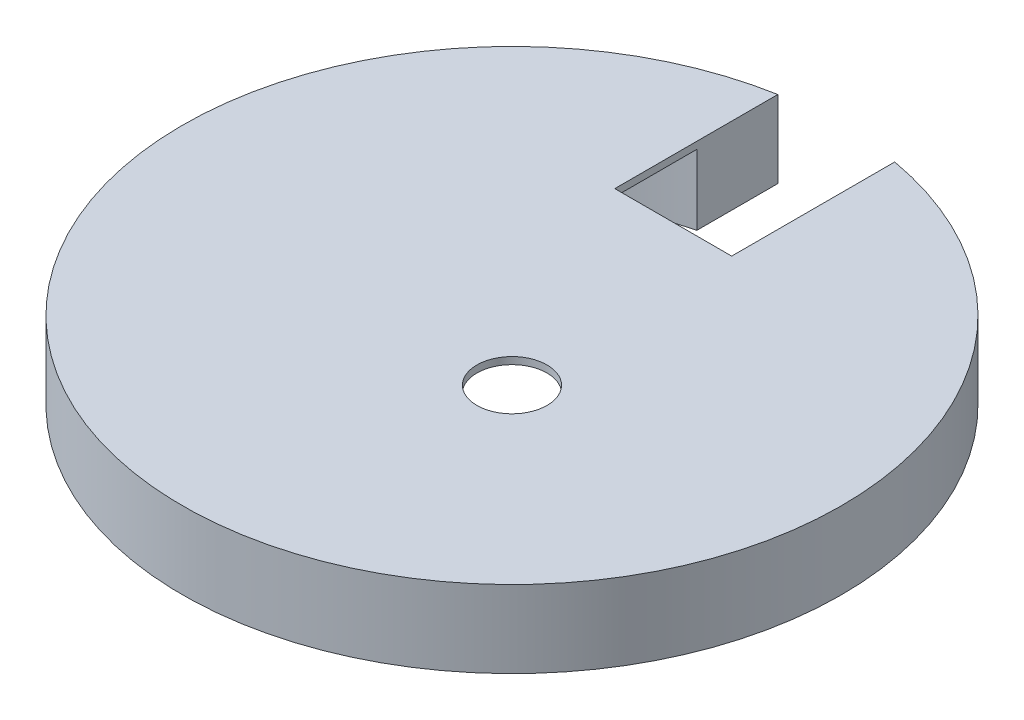
ISO-10303-21;
HEADER;
FILE_DESCRIPTION(('STEP AP214'),'2;1');
FILE_NAME('part.step','',(''),(''),'','','');
FILE_SCHEMA(('AUTOMOTIVE_DESIGN { 1 0 10303 214 1 1 1 1 }'));
ENDSEC;
DATA;
#1=APPLICATION_CONTEXT('core data for automotive mechanical design processes');
#2=APPLICATION_PROTOCOL_DEFINITION('international standard','automotive_design',2000,#1);
#3=PRODUCT_CONTEXT('',#1,'mechanical');
#4=PRODUCT('Part','Part','',(#3));
#5=PRODUCT_RELATED_PRODUCT_CATEGORY('part','',(#4));
#6=PRODUCT_DEFINITION_FORMATION('','',#4);
#7=PRODUCT_DEFINITION_CONTEXT('part definition',#1,'design');
#8=PRODUCT_DEFINITION('design','',#6,#7);
#9=PRODUCT_DEFINITION_SHAPE('','',#8);
#10=(LENGTH_UNIT() NAMED_UNIT(*) SI_UNIT(.MILLI.,.METRE.));
#11=(NAMED_UNIT(*) PLANE_ANGLE_UNIT() SI_UNIT($,.RADIAN.));
#12=(NAMED_UNIT(*) SI_UNIT($,.STERADIAN.) SOLID_ANGLE_UNIT());
#13=UNCERTAINTY_MEASURE_WITH_UNIT(LENGTH_MEASURE(1.E-05),#10,'distance_accuracy_value','');
#14=(GEOMETRIC_REPRESENTATION_CONTEXT(3) GLOBAL_UNCERTAINTY_ASSIGNED_CONTEXT((#13)) GLOBAL_UNIT_ASSIGNED_CONTEXT((#10,
#11,#12)) REPRESENTATION_CONTEXT('',''));
#15=CARTESIAN_POINT('',(0.,0.,0.));
#16=DIRECTION('',(0.,0.,1.));
#17=DIRECTION('',(1.,0.,0.));
#18=AXIS2_PLACEMENT_3D('',#15,#16,#17);
#19=CARTESIAN_POINT('',(0.,10.,0.));
#20=DIRECTION('',(0.,-1.,0.));
#21=DIRECTION('',(0.,0.,-1.));
#22=AXIS2_PLACEMENT_3D('',#19,#20,#21);
#23=CYLINDRICAL_SURFACE('',#22,46.97);
#24=CARTESIAN_POINT('',(0.,0.,0.));
#25=DIRECTION('',(0.,1.,0.));
#26=DIRECTION('',(0.,0.,1.));
#27=AXIS2_PLACEMENT_3D('',#24,#25,#26);
#28=CIRCLE('',#27,46.97);
#29=CARTESIAN_POINT('',(-8.33,0.,-46.2254475370439));
#30=VERTEX_POINT('',#29);
#31=CARTESIAN_POINT('',(8.33,0.,-46.2254475370439));
#32=VERTEX_POINT('',#31);
#33=EDGE_CURVE('E86',#30,#32,#28,.T.);
#34=ORIENTED_EDGE('',*,*,#33,.T.);
#35=DIRECTION('',(0.,-1.,0.));
#36=VECTOR('',#35,1.);
#37=CARTESIAN_POINT('',(8.33,10.,-46.2254475370439));
#38=LINE('',#37,#36);
#39=CARTESIAN_POINT('',(8.33,11.,-46.2254475370439));
#40=VERTEX_POINT('',#39);
#41=EDGE_CURVE('E11',#40,#32,#38,.T.);
#42=ORIENTED_EDGE('',*,*,#41,.F.);
#43=CARTESIAN_POINT('',(0.,11.,0.));
#44=DIRECTION('',(0.,1.,0.));
#45=DIRECTION('',(0.,0.,1.));
#46=AXIS2_PLACEMENT_3D('',#43,#44,#45);
#47=CIRCLE('',#46,46.97);
#48=CARTESIAN_POINT('',(-8.33,11.,-46.2254475370439));
#49=VERTEX_POINT('',#48);
#50=EDGE_CURVE('E97',#49,#40,#47,.T.);
#51=ORIENTED_EDGE('',*,*,#50,.F.);
#52=DIRECTION('',(0.,-1.,0.));
#53=VECTOR('',#52,1.);
#54=CARTESIAN_POINT('',(-8.33,10.,-46.2254475370439));
#55=LINE('',#54,#53);
#56=EDGE_CURVE('E81',#49,#30,#55,.T.);
#57=ORIENTED_EDGE('',*,*,#56,.T.);
#58=EDGE_LOOP('',(#34,#42,#51,#57));
#59=FACE_BOUND('',#58,.T.);
#60=ADVANCED_FACE('F33',(#59),#23,.T.);
#61=CARTESIAN_POINT('',(8.33,10.,-34.6855135187948));
#62=DIRECTION('',(1.,0.,0.));
#63=DIRECTION('',(0.,0.,-1.));
#64=AXIS2_PLACEMENT_3D('',#61,#62,#63);
#65=PLANE('',#64);
#66=DIRECTION('',(0.,0.,1.));
#67=VECTOR('',#66,1.);
#68=CARTESIAN_POINT('',(8.33,0.,-34.6855135187948));
#69=LINE('',#68,#67);
#70=CARTESIAN_POINT('',(8.33,0.,-34.6855135187948));
#71=VERTEX_POINT('',#70);
#72=EDGE_CURVE('E71',#32,#71,#69,.T.);
#73=ORIENTED_EDGE('',*,*,#72,.T.);
#74=DIRECTION('',(0.,-1.,0.));
#75=VECTOR('',#74,1.);
#76=CARTESIAN_POINT('',(8.33,10.,-34.6855135187948));
#77=LINE('',#76,#75);
#78=CARTESIAN_POINT('',(8.33,10.,-34.6855135187948));
#79=VERTEX_POINT('',#78);
#80=EDGE_CURVE('E41',#79,#71,#77,.T.);
#81=ORIENTED_EDGE('',*,*,#80,.F.);
#82=DIRECTION('',(0.,0.,1.));
#83=VECTOR('',#82,1.);
#84=CARTESIAN_POINT('',(8.33,10.,-22.9854475370439));
#85=LINE('',#84,#83);
#86=CARTESIAN_POINT('',(8.33,10.,-22.9854475370439));
#87=VERTEX_POINT('',#86);
#88=EDGE_CURVE('E119',#79,#87,#85,.T.);
#89=ORIENTED_EDGE('',*,*,#88,.T.);
#90=DIRECTION('',(0.,-1.,0.));
#91=VECTOR('',#90,1.);
#92=CARTESIAN_POINT('',(8.33,11.,-22.9854475370439));
#93=LINE('',#92,#91);
#94=CARTESIAN_POINT('',(8.33,11.,-22.9854475370439));
#95=VERTEX_POINT('',#94);
#96=EDGE_CURVE('E113',#95,#87,#93,.T.);
#97=ORIENTED_EDGE('',*,*,#96,.F.);
#98=DIRECTION('',(0.,0.,1.));
#99=VECTOR('',#98,1.);
#100=CARTESIAN_POINT('',(8.33,11.,-22.9854475370439));
#101=LINE('',#100,#99);
#102=EDGE_CURVE('E115',#40,#95,#101,.T.);
#103=ORIENTED_EDGE('',*,*,#102,.F.);
#104=ORIENTED_EDGE('',*,*,#41,.T.);
#105=EDGE_LOOP('',(#73,#81,#89,#97,#103,#104));
#106=FACE_BOUND('',#105,.T.);
#107=ADVANCED_FACE('F128',(#106),#65,.F.);
#108=CARTESIAN_POINT('',(0.,10.,0.));
#109=DIRECTION('',(0.,-1.,0.));
#110=DIRECTION('',(0.,0.,-1.));
#111=AXIS2_PLACEMENT_3D('',#108,#109,#110);
#112=CYLINDRICAL_SURFACE('',#111,35.67175);
#113=CARTESIAN_POINT('',(0.,0.,0.));
#114=DIRECTION('',(0.,-1.,0.));
#115=DIRECTION('',(0.,0.,1.));
#116=AXIS2_PLACEMENT_3D('',#113,#114,#115);
#117=CIRCLE('',#116,35.67175);
#118=CARTESIAN_POINT('',(-8.33,0.,-34.6855135187948));
#119=VERTEX_POINT('',#118);
#120=EDGE_CURVE('E63',#71,#119,#117,.T.);
#121=ORIENTED_EDGE('',*,*,#120,.T.);
#122=DIRECTION('',(0.,-1.,0.));
#123=VECTOR('',#122,1.);
#124=CARTESIAN_POINT('',(-8.33,10.,-34.6855135187948));
#125=LINE('',#124,#123);
#126=CARTESIAN_POINT('',(-8.33,10.,-34.6855135187948));
#127=VERTEX_POINT('',#126);
#128=EDGE_CURVE('E66',#127,#119,#125,.T.);
#129=ORIENTED_EDGE('',*,*,#128,.F.);
#130=CARTESIAN_POINT('',(0.,10.,0.));
#131=DIRECTION('',(0.,-1.,0.));
#132=DIRECTION('',(0.,0.,1.));
#133=AXIS2_PLACEMENT_3D('',#130,#131,#132);
#134=CIRCLE('',#133,35.67175);
#135=EDGE_CURVE('E87',#79,#127,#134,.T.);
#136=ORIENTED_EDGE('',*,*,#135,.F.);
#137=ORIENTED_EDGE('',*,*,#80,.T.);
#138=EDGE_LOOP('',(#121,#129,#136,#137));
#139=FACE_BOUND('',#138,.T.);
#140=ADVANCED_FACE('F65',(#139),#112,.F.);
#141=CARTESIAN_POINT('',(-8.33,10.,-46.2254475370439));
#142=DIRECTION('',(-1.,0.,0.));
#143=DIRECTION('',(0.,0.,1.));
#144=AXIS2_PLACEMENT_3D('',#141,#142,#143);
#145=PLANE('',#144);
#146=DIRECTION('',(0.,0.,-1.));
#147=VECTOR('',#146,1.);
#148=CARTESIAN_POINT('',(-8.33,0.,-46.2254475370439));
#149=LINE('',#148,#147);
#150=EDGE_CURVE('E70',#119,#30,#149,.T.);
#151=ORIENTED_EDGE('',*,*,#150,.T.);
#152=ORIENTED_EDGE('',*,*,#56,.F.);
#153=DIRECTION('',(0.,0.,-1.));
#154=VECTOR('',#153,1.);
#155=CARTESIAN_POINT('',(-8.33,11.,-46.2254475370439));
#156=LINE('',#155,#154);
#157=CARTESIAN_POINT('',(-8.33,11.,-22.9854475370439));
#158=VERTEX_POINT('',#157);
#159=EDGE_CURVE('E101',#158,#49,#156,.T.);
#160=ORIENTED_EDGE('',*,*,#159,.F.);
#161=DIRECTION('',(0.,-1.,0.));
#162=VECTOR('',#161,1.);
#163=CARTESIAN_POINT('',(-8.33,11.,-22.9854475370439));
#164=LINE('',#163,#162);
#165=CARTESIAN_POINT('',(-8.33,10.,-22.9854475370439));
#166=VERTEX_POINT('',#165);
#167=EDGE_CURVE('E111',#158,#166,#164,.T.);
#168=ORIENTED_EDGE('',*,*,#167,.T.);
#169=DIRECTION('',(0.,0.,-1.));
#170=VECTOR('',#169,1.);
#171=CARTESIAN_POINT('',(-8.33,10.,-46.2254475370439));
#172=LINE('',#171,#170);
#173=EDGE_CURVE('E80',#166,#127,#172,.T.);
#174=ORIENTED_EDGE('',*,*,#173,.T.);
#175=ORIENTED_EDGE('',*,*,#128,.T.);
#176=EDGE_LOOP('',(#151,#152,#160,#168,#174,#175));
#177=FACE_BOUND('',#176,.T.);
#178=ADVANCED_FACE('F75',(#177),#145,.F.);
#179=CARTESIAN_POINT('',(0.,0.,0.));
#180=DIRECTION('',(0.,1.,0.));
#181=DIRECTION('',(0.,0.,1.));
#182=AXIS2_PLACEMENT_3D('',#179,#180,#181);
#183=PLANE('',#182);
#184=ORIENTED_EDGE('',*,*,#33,.F.);
#185=ORIENTED_EDGE('',*,*,#150,.F.);
#186=ORIENTED_EDGE('',*,*,#120,.F.);
#187=ORIENTED_EDGE('',*,*,#72,.F.);
#188=EDGE_LOOP('',(#184,#185,#186,#187));
#189=FACE_BOUND('',#188,.T.);
#190=ADVANCED_FACE('F84',(#189),#183,.F.);
#191=CARTESIAN_POINT('',(0.,10.,0.));
#192=DIRECTION('',(0.,1.,0.));
#193=DIRECTION('',(0.,0.,1.));
#194=AXIS2_PLACEMENT_3D('',#191,#192,#193);
#195=PLANE('',#194);
#196=CARTESIAN_POINT('',(8.6054895270403,10.,8.60548952704027));
#197=DIRECTION('',(0.,1.,0.));
#198=DIRECTION('',(0.,0.,1.));
#199=AXIS2_PLACEMENT_3D('',#196,#197,#198);
#200=CIRCLE('',#199,5.);
#201=CARTESIAN_POINT('',(8.6054895270403,10.,13.6054895270403));
#202=VERTEX_POINT('',#201);
#203=EDGE_CURVE('E122',#202,#202,#200,.T.);
#204=ORIENTED_EDGE('',*,*,#203,.T.);
#205=EDGE_LOOP('',(#204));
#206=FACE_BOUND('',#205,.T.);
#207=ORIENTED_EDGE('',*,*,#88,.F.);
#208=ORIENTED_EDGE('',*,*,#135,.T.);
#209=ORIENTED_EDGE('',*,*,#173,.F.);
#210=DIRECTION('',(-1.,0.,0.));
#211=VECTOR('',#210,1.);
#212=CARTESIAN_POINT('',(-8.33,10.,-22.9854475370439));
#213=LINE('',#212,#211);
#214=EDGE_CURVE('E121',#87,#166,#213,.T.);
#215=ORIENTED_EDGE('',*,*,#214,.F.);
#216=EDGE_LOOP('',(#207,#208,#209,#215));
#217=FACE_BOUND('',#216,.T.);
#218=ADVANCED_FACE('F143',(#206,#217),#195,.F.);
#219=CARTESIAN_POINT('',(-8.33,11.,-22.9854475370439));
#220=DIRECTION('',(0.,0.,1.));
#221=DIRECTION('',(1.,0.,0.));
#222=AXIS2_PLACEMENT_3D('',#219,#220,#221);
#223=PLANE('',#222);
#224=ORIENTED_EDGE('',*,*,#214,.T.);
#225=ORIENTED_EDGE('',*,*,#167,.F.);
#226=DIRECTION('',(-1.,0.,0.));
#227=VECTOR('',#226,1.);
#228=CARTESIAN_POINT('',(-8.33,11.,-22.9854475370439));
#229=LINE('',#228,#227);
#230=EDGE_CURVE('E109',#95,#158,#229,.T.);
#231=ORIENTED_EDGE('',*,*,#230,.F.);
#232=ORIENTED_EDGE('',*,*,#96,.T.);
#233=EDGE_LOOP('',(#224,#225,#231,#232));
#234=FACE_BOUND('',#233,.T.);
#235=ADVANCED_FACE('F142',(#234),#223,.F.);
#236=CARTESIAN_POINT('',(0.,11.,0.));
#237=DIRECTION('',(0.,1.,0.));
#238=DIRECTION('',(0.,0.,1.));
#239=AXIS2_PLACEMENT_3D('',#236,#237,#238);
#240=PLANE('',#239);
#241=CARTESIAN_POINT('',(8.6054895270403,11.,8.60548952704027));
#242=DIRECTION('',(0.,1.,0.));
#243=DIRECTION('',(0.,0.,1.));
#244=AXIS2_PLACEMENT_3D('',#241,#242,#243);
#245=CIRCLE('',#244,5.);
#246=CARTESIAN_POINT('',(8.6054895270403,11.,13.6054895270403));
#247=VERTEX_POINT('',#246);
#248=EDGE_CURVE('E229',#247,#247,#245,.T.);
#249=ORIENTED_EDGE('',*,*,#248,.F.);
#250=EDGE_LOOP('',(#249));
#251=FACE_BOUND('',#250,.T.);
#252=ORIENTED_EDGE('',*,*,#50,.T.);
#253=ORIENTED_EDGE('',*,*,#102,.T.);
#254=ORIENTED_EDGE('',*,*,#230,.T.);
#255=ORIENTED_EDGE('',*,*,#159,.T.);
#256=EDGE_LOOP('',(#252,#253,#254,#255));
#257=FACE_BOUND('',#256,.T.);
#258=ADVANCED_FACE('F105',(#251,#257),#240,.T.);
#259=CARTESIAN_POINT('',(8.6054895270403,0.,8.60548952704027));
#260=DIRECTION('',(0.,1.,0.));
#261=DIRECTION('',(0.,0.,1.));
#262=AXIS2_PLACEMENT_3D('',#259,#260,#261);
#263=CYLINDRICAL_SURFACE('',#262,5.);
#264=ORIENTED_EDGE('',*,*,#248,.T.);
#265=EDGE_LOOP('',(#264));
#266=FACE_BOUND('',#265,.T.);
#267=ORIENTED_EDGE('',*,*,#203,.F.);
#268=EDGE_LOOP('',(#267));
#269=FACE_BOUND('',#268,.T.);
#270=ADVANCED_FACE('F213',(#266,#269),#263,.F.);
#271=CLOSED_SHELL('',(#60,#107,#140,#178,#190,#218,#235,#258,#270));
#272=MANIFOLD_SOLID_BREP('B2',#271);
#273=ADVANCED_BREP_SHAPE_REPRESENTATION('',(#18,#272),#14);
#274=SHAPE_DEFINITION_REPRESENTATION(#9,#273);
ENDSEC;
END-ISO-10303-21;
